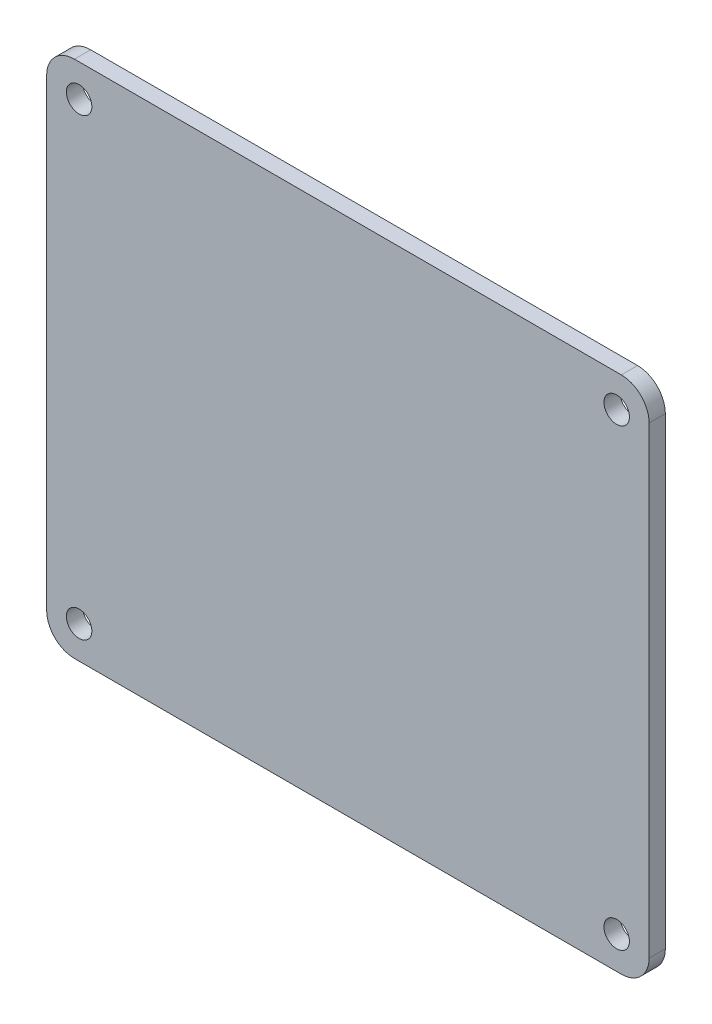
ISO-10303-21;
HEADER;
FILE_DESCRIPTION(('STEP AP214'),'2;1');
FILE_NAME('part.step','',(''),(''),'','','');
FILE_SCHEMA(('AUTOMOTIVE_DESIGN { 1 0 10303 214 1 1 1 1 }'));
ENDSEC;
DATA;
#1=APPLICATION_CONTEXT('core data for automotive mechanical design processes');
#2=APPLICATION_PROTOCOL_DEFINITION('international standard','automotive_design',2000,#1);
#3=PRODUCT_CONTEXT('',#1,'mechanical');
#4=PRODUCT('Part','Part','',(#3));
#5=PRODUCT_RELATED_PRODUCT_CATEGORY('part','',(#4));
#6=PRODUCT_DEFINITION_FORMATION('','',#4);
#7=PRODUCT_DEFINITION_CONTEXT('part definition',#1,'design');
#8=PRODUCT_DEFINITION('design','',#6,#7);
#9=PRODUCT_DEFINITION_SHAPE('','',#8);
#10=(LENGTH_UNIT() NAMED_UNIT(*) SI_UNIT(.MILLI.,.METRE.));
#11=(NAMED_UNIT(*) PLANE_ANGLE_UNIT() SI_UNIT($,.RADIAN.));
#12=(NAMED_UNIT(*) SI_UNIT($,.STERADIAN.) SOLID_ANGLE_UNIT());
#13=UNCERTAINTY_MEASURE_WITH_UNIT(LENGTH_MEASURE(1.E-05),#10,'distance_accuracy_value','');
#14=(GEOMETRIC_REPRESENTATION_CONTEXT(3) GLOBAL_UNCERTAINTY_ASSIGNED_CONTEXT((#13)) GLOBAL_UNIT_ASSIGNED_CONTEXT((#10,
#11,#12)) REPRESENTATION_CONTEXT('',''));
#15=CARTESIAN_POINT('',(0.,0.,0.));
#16=DIRECTION('',(0.,0.,1.));
#17=DIRECTION('',(1.,0.,0.));
#18=AXIS2_PLACEMENT_3D('',#15,#16,#17);
#19=CARTESIAN_POINT('',(29.,-24.5,0.));
#20=DIRECTION('',(0.,0.,-1.));
#21=DIRECTION('',(-1.,0.,0.));
#22=AXIS2_PLACEMENT_3D('',#19,#20,#21);
#23=CYLINDRICAL_SURFACE('',#22,1.375);
#24=CARTESIAN_POINT('',(29.,-24.5,1.75));
#25=DIRECTION('',(0.,0.,-1.));
#26=DIRECTION('',(-1.,0.,0.));
#27=AXIS2_PLACEMENT_3D('',#24,#25,#26);
#28=CIRCLE('',#27,1.375);
#29=CARTESIAN_POINT('',(30.375,-24.5,1.75));
#30=VERTEX_POINT('',#29);
#31=EDGE_CURVE('E35',#30,#30,#28,.T.);
#32=ORIENTED_EDGE('',*,*,#31,.F.);
#33=EDGE_LOOP('',(#32));
#34=FACE_BOUND('',#33,.T.);
#35=CARTESIAN_POINT('',(29.,-24.5,0.));
#36=DIRECTION('',(0.,0.,1.));
#37=DIRECTION('',(-1.,0.,0.));
#38=AXIS2_PLACEMENT_3D('',#35,#36,#37);
#39=CIRCLE('',#38,1.375);
#40=CARTESIAN_POINT('',(30.375,-24.5,0.));
#41=VERTEX_POINT('',#40);
#42=EDGE_CURVE('E109',#41,#41,#39,.T.);
#43=ORIENTED_EDGE('',*,*,#42,.F.);
#44=EDGE_LOOP('',(#43));
#45=FACE_BOUND('',#44,.T.);
#46=ADVANCED_FACE('F17',(#34,#45),#23,.F.);
#47=CARTESIAN_POINT('',(-29.,-24.5,0.));
#48=DIRECTION('',(0.,0.,-1.));
#49=DIRECTION('',(-1.,0.,0.));
#50=AXIS2_PLACEMENT_3D('',#47,#48,#49);
#51=CYLINDRICAL_SURFACE('',#50,1.375);
#52=CARTESIAN_POINT('',(-29.,-24.5,1.75));
#53=DIRECTION('',(0.,0.,-1.));
#54=DIRECTION('',(-1.,0.,0.));
#55=AXIS2_PLACEMENT_3D('',#52,#53,#54);
#56=CIRCLE('',#55,1.375);
#57=CARTESIAN_POINT('',(-27.625,-24.5,1.75));
#58=VERTEX_POINT('',#57);
#59=EDGE_CURVE('E145',#58,#58,#56,.T.);
#60=ORIENTED_EDGE('',*,*,#59,.F.);
#61=EDGE_LOOP('',(#60));
#62=FACE_BOUND('',#61,.T.);
#63=CARTESIAN_POINT('',(-29.,-24.5,0.));
#64=DIRECTION('',(0.,0.,1.));
#65=DIRECTION('',(-1.,0.,0.));
#66=AXIS2_PLACEMENT_3D('',#63,#64,#65);
#67=CIRCLE('',#66,1.375);
#68=CARTESIAN_POINT('',(-27.625,-24.5,0.));
#69=VERTEX_POINT('',#68);
#70=EDGE_CURVE('E106',#69,#69,#67,.T.);
#71=ORIENTED_EDGE('',*,*,#70,.F.);
#72=EDGE_LOOP('',(#71));
#73=FACE_BOUND('',#72,.T.);
#74=ADVANCED_FACE('F107',(#62,#73),#51,.F.);
#75=CARTESIAN_POINT('',(29.,24.5,0.));
#76=DIRECTION('',(0.,0.,-1.));
#77=DIRECTION('',(-1.,0.,0.));
#78=AXIS2_PLACEMENT_3D('',#75,#76,#77);
#79=CYLINDRICAL_SURFACE('',#78,1.375);
#80=CARTESIAN_POINT('',(29.,24.5,1.75));
#81=DIRECTION('',(0.,0.,-1.));
#82=DIRECTION('',(-1.,0.,0.));
#83=AXIS2_PLACEMENT_3D('',#80,#81,#82);
#84=CIRCLE('',#83,1.375);
#85=CARTESIAN_POINT('',(30.375,24.5,1.75));
#86=VERTEX_POINT('',#85);
#87=EDGE_CURVE('E141',#86,#86,#84,.T.);
#88=ORIENTED_EDGE('',*,*,#87,.F.);
#89=EDGE_LOOP('',(#88));
#90=FACE_BOUND('',#89,.T.);
#91=CARTESIAN_POINT('',(29.,24.5,0.));
#92=DIRECTION('',(0.,0.,1.));
#93=DIRECTION('',(-1.,0.,0.));
#94=AXIS2_PLACEMENT_3D('',#91,#92,#93);
#95=CIRCLE('',#94,1.375);
#96=CARTESIAN_POINT('',(30.375,24.5,0.));
#97=VERTEX_POINT('',#96);
#98=EDGE_CURVE('E110',#97,#97,#95,.T.);
#99=ORIENTED_EDGE('',*,*,#98,.F.);
#100=EDGE_LOOP('',(#99));
#101=FACE_BOUND('',#100,.T.);
#102=ADVANCED_FACE('F258',(#90,#101),#79,.F.);
#103=CARTESIAN_POINT('',(-29.,24.5,0.));
#104=DIRECTION('',(0.,0.,-1.));
#105=DIRECTION('',(-1.,0.,0.));
#106=AXIS2_PLACEMENT_3D('',#103,#104,#105);
#107=CYLINDRICAL_SURFACE('',#106,1.375);
#108=CARTESIAN_POINT('',(-29.,24.5,1.75));
#109=DIRECTION('',(0.,0.,-1.));
#110=DIRECTION('',(-1.,0.,0.));
#111=AXIS2_PLACEMENT_3D('',#108,#109,#110);
#112=CIRCLE('',#111,1.375);
#113=CARTESIAN_POINT('',(-27.625,24.5,1.75));
#114=VERTEX_POINT('',#113);
#115=EDGE_CURVE('E139',#114,#114,#112,.T.);
#116=ORIENTED_EDGE('',*,*,#115,.F.);
#117=EDGE_LOOP('',(#116));
#118=FACE_BOUND('',#117,.T.);
#119=CARTESIAN_POINT('',(-29.,24.5,0.));
#120=DIRECTION('',(0.,0.,1.));
#121=DIRECTION('',(-1.,0.,0.));
#122=AXIS2_PLACEMENT_3D('',#119,#120,#121);
#123=CIRCLE('',#122,1.375);
#124=CARTESIAN_POINT('',(-27.625,24.5,0.));
#125=VERTEX_POINT('',#124);
#126=EDGE_CURVE('E116',#125,#125,#123,.T.);
#127=ORIENTED_EDGE('',*,*,#126,.F.);
#128=EDGE_LOOP('',(#127));
#129=FACE_BOUND('',#128,.T.);
#130=ADVANCED_FACE('F249',(#118,#129),#107,.F.);
#131=CARTESIAN_POINT('',(-29.5,25.,0.));
#132=DIRECTION('',(0.,0.,-1.));
#133=DIRECTION('',(0.,1.,0.));
#134=AXIS2_PLACEMENT_3D('',#131,#132,#133);
#135=CYLINDRICAL_SURFACE('',#134,3.);
#136=CARTESIAN_POINT('',(-29.5,25.,0.));
#137=DIRECTION('',(0.,0.,1.));
#138=DIRECTION('',(0.,1.,0.));
#139=AXIS2_PLACEMENT_3D('',#136,#137,#138);
#140=CIRCLE('',#139,3.);
#141=CARTESIAN_POINT('',(-29.5,28.,0.));
#142=VERTEX_POINT('',#141);
#143=CARTESIAN_POINT('',(-32.5,25.,0.));
#144=VERTEX_POINT('',#143);
#145=EDGE_CURVE('E11',#142,#144,#140,.T.);
#146=ORIENTED_EDGE('',*,*,#145,.T.);
#147=DIRECTION('',(0.,0.,1.));
#148=VECTOR('',#147,1.);
#149=CARTESIAN_POINT('',(-32.5,25.,0.));
#150=LINE('',#149,#148);
#151=CARTESIAN_POINT('',(-32.5,25.,1.75));
#152=VERTEX_POINT('',#151);
#153=EDGE_CURVE('E28',#144,#152,#150,.T.);
#154=ORIENTED_EDGE('',*,*,#153,.T.);
#155=CARTESIAN_POINT('',(-29.5,25.,1.75));
#156=DIRECTION('',(0.,0.,1.));
#157=DIRECTION('',(0.,1.,0.));
#158=AXIS2_PLACEMENT_3D('',#155,#156,#157);
#159=CIRCLE('',#158,3.);
#160=CARTESIAN_POINT('',(-29.5,28.,1.75));
#161=VERTEX_POINT('',#160);
#162=EDGE_CURVE('E113',#161,#152,#159,.T.);
#163=ORIENTED_EDGE('',*,*,#162,.F.);
#164=DIRECTION('',(0.,0.,1.));
#165=VECTOR('',#164,1.);
#166=CARTESIAN_POINT('',(-29.5,28.,0.));
#167=LINE('',#166,#165);
#168=EDGE_CURVE('E137',#142,#161,#167,.T.);
#169=ORIENTED_EDGE('',*,*,#168,.F.);
#170=EDGE_LOOP('',(#146,#154,#163,#169));
#171=FACE_BOUND('',#170,.T.);
#172=ADVANCED_FACE('F247',(#171),#135,.T.);
#173=CARTESIAN_POINT('',(29.5,28.,0.));
#174=DIRECTION('',(0.,1.,0.));
#175=DIRECTION('',(-1.,0.,0.));
#176=AXIS2_PLACEMENT_3D('',#173,#174,#175);
#177=PLANE('',#176);
#178=DIRECTION('',(-1.,0.,0.));
#179=VECTOR('',#178,1.);
#180=CARTESIAN_POINT('',(29.5,28.,0.));
#181=LINE('',#180,#179);
#182=CARTESIAN_POINT('',(29.5,28.,0.));
#183=VERTEX_POINT('',#182);
#184=EDGE_CURVE('E161',#183,#142,#181,.T.);
#185=ORIENTED_EDGE('',*,*,#184,.T.);
#186=ORIENTED_EDGE('',*,*,#168,.T.);
#187=DIRECTION('',(-1.,0.,0.));
#188=VECTOR('',#187,1.);
#189=CARTESIAN_POINT('',(29.5,28.,1.75));
#190=LINE('',#189,#188);
#191=CARTESIAN_POINT('',(29.5,28.,1.75));
#192=VERTEX_POINT('',#191);
#193=EDGE_CURVE('E187',#192,#161,#190,.T.);
#194=ORIENTED_EDGE('',*,*,#193,.F.);
#195=DIRECTION('',(0.,0.,1.));
#196=VECTOR('',#195,1.);
#197=CARTESIAN_POINT('',(29.5,28.,0.));
#198=LINE('',#197,#196);
#199=EDGE_CURVE('E138',#183,#192,#198,.T.);
#200=ORIENTED_EDGE('',*,*,#199,.F.);
#201=EDGE_LOOP('',(#185,#186,#194,#200));
#202=FACE_BOUND('',#201,.T.);
#203=ADVANCED_FACE('F245',(#202),#177,.T.);
#204=CARTESIAN_POINT('',(29.5,25.,0.));
#205=DIRECTION('',(0.,0.,-1.));
#206=DIRECTION('',(1.,0.,0.));
#207=AXIS2_PLACEMENT_3D('',#204,#205,#206);
#208=CYLINDRICAL_SURFACE('',#207,3.);
#209=CARTESIAN_POINT('',(29.5,25.,0.));
#210=DIRECTION('',(0.,0.,1.));
#211=DIRECTION('',(1.,0.,0.));
#212=AXIS2_PLACEMENT_3D('',#209,#210,#211);
#213=CIRCLE('',#212,3.);
#214=CARTESIAN_POINT('',(32.5,25.,0.));
#215=VERTEX_POINT('',#214);
#216=EDGE_CURVE('E134',#215,#183,#213,.T.);
#217=ORIENTED_EDGE('',*,*,#216,.T.);
#218=ORIENTED_EDGE('',*,*,#199,.T.);
#219=CARTESIAN_POINT('',(29.5,25.,1.75));
#220=DIRECTION('',(0.,0.,1.));
#221=DIRECTION('',(1.,0.,0.));
#222=AXIS2_PLACEMENT_3D('',#219,#220,#221);
#223=CIRCLE('',#222,3.);
#224=CARTESIAN_POINT('',(32.5,25.,1.75));
#225=VERTEX_POINT('',#224);
#226=EDGE_CURVE('E21',#225,#192,#223,.T.);
#227=ORIENTED_EDGE('',*,*,#226,.F.);
#228=DIRECTION('',(0.,0.,1.));
#229=VECTOR('',#228,1.);
#230=CARTESIAN_POINT('',(32.5,25.,0.));
#231=LINE('',#230,#229);
#232=EDGE_CURVE('E194',#215,#225,#231,.T.);
#233=ORIENTED_EDGE('',*,*,#232,.F.);
#234=EDGE_LOOP('',(#217,#218,#227,#233));
#235=FACE_BOUND('',#234,.T.);
#236=ADVANCED_FACE('F237',(#235),#208,.T.);
#237=CARTESIAN_POINT('',(32.5,-25.,0.));
#238=DIRECTION('',(1.,0.,0.));
#239=DIRECTION('',(0.,1.,0.));
#240=AXIS2_PLACEMENT_3D('',#237,#238,#239);
#241=PLANE('',#240);
#242=DIRECTION('',(0.,1.,0.));
#243=VECTOR('',#242,1.);
#244=CARTESIAN_POINT('',(32.5,-25.,0.));
#245=LINE('',#244,#243);
#246=CARTESIAN_POINT('',(32.5,-25.,0.));
#247=VERTEX_POINT('',#246);
#248=EDGE_CURVE('E184',#247,#215,#245,.T.);
#249=ORIENTED_EDGE('',*,*,#248,.T.);
#250=ORIENTED_EDGE('',*,*,#232,.T.);
#251=DIRECTION('',(0.,1.,0.));
#252=VECTOR('',#251,1.);
#253=CARTESIAN_POINT('',(32.5,-25.,1.75));
#254=LINE('',#253,#252);
#255=CARTESIAN_POINT('',(32.5,-25.,1.75));
#256=VERTEX_POINT('',#255);
#257=EDGE_CURVE('E84',#256,#225,#254,.T.);
#258=ORIENTED_EDGE('',*,*,#257,.F.);
#259=DIRECTION('',(0.,0.,1.));
#260=VECTOR('',#259,1.);
#261=CARTESIAN_POINT('',(32.5,-25.,0.));
#262=LINE('',#261,#260);
#263=EDGE_CURVE('E90',#247,#256,#262,.T.);
#264=ORIENTED_EDGE('',*,*,#263,.F.);
#265=EDGE_LOOP('',(#249,#250,#258,#264));
#266=FACE_BOUND('',#265,.T.);
#267=ADVANCED_FACE('F240',(#266),#241,.T.);
#268=CARTESIAN_POINT('',(29.5,-25.,0.));
#269=DIRECTION('',(0.,0.,-1.));
#270=DIRECTION('',(0.,-1.,0.));
#271=AXIS2_PLACEMENT_3D('',#268,#269,#270);
#272=CYLINDRICAL_SURFACE('',#271,3.);
#273=CARTESIAN_POINT('',(29.5,-25.,0.));
#274=DIRECTION('',(0.,0.,1.));
#275=DIRECTION('',(0.,-1.,0.));
#276=AXIS2_PLACEMENT_3D('',#273,#274,#275);
#277=CIRCLE('',#276,3.);
#278=CARTESIAN_POINT('',(29.5,-28.,0.));
#279=VERTEX_POINT('',#278);
#280=EDGE_CURVE('E180',#279,#247,#277,.T.);
#281=ORIENTED_EDGE('',*,*,#280,.T.);
#282=ORIENTED_EDGE('',*,*,#263,.T.);
#283=CARTESIAN_POINT('',(29.5,-25.,1.75));
#284=DIRECTION('',(0.,0.,1.));
#285=DIRECTION('',(0.,-1.,0.));
#286=AXIS2_PLACEMENT_3D('',#283,#284,#285);
#287=CIRCLE('',#286,3.);
#288=CARTESIAN_POINT('',(29.5,-28.,1.75));
#289=VERTEX_POINT('',#288);
#290=EDGE_CURVE('E124',#289,#256,#287,.T.);
#291=ORIENTED_EDGE('',*,*,#290,.F.);
#292=DIRECTION('',(0.,0.,1.));
#293=VECTOR('',#292,1.);
#294=CARTESIAN_POINT('',(29.5,-28.,0.));
#295=LINE('',#294,#293);
#296=EDGE_CURVE('E125',#279,#289,#295,.T.);
#297=ORIENTED_EDGE('',*,*,#296,.F.);
#298=EDGE_LOOP('',(#281,#282,#291,#297));
#299=FACE_BOUND('',#298,.T.);
#300=ADVANCED_FACE('F19',(#299),#272,.T.);
#301=CARTESIAN_POINT('',(-29.5,-28.,0.));
#302=DIRECTION('',(0.,-1.,0.));
#303=DIRECTION('',(1.,0.,0.));
#304=AXIS2_PLACEMENT_3D('',#301,#302,#303);
#305=PLANE('',#304);
#306=DIRECTION('',(1.,0.,0.));
#307=VECTOR('',#306,1.);
#308=CARTESIAN_POINT('',(-29.5,-28.,0.));
#309=LINE('',#308,#307);
#310=CARTESIAN_POINT('',(-29.5,-28.,0.));
#311=VERTEX_POINT('',#310);
#312=EDGE_CURVE('E129',#311,#279,#309,.T.);
#313=ORIENTED_EDGE('',*,*,#312,.T.);
#314=ORIENTED_EDGE('',*,*,#296,.T.);
#315=DIRECTION('',(1.,0.,0.));
#316=VECTOR('',#315,1.);
#317=CARTESIAN_POINT('',(-29.5,-28.,1.75));
#318=LINE('',#317,#316);
#319=CARTESIAN_POINT('',(-29.5,-28.,1.75));
#320=VERTEX_POINT('',#319);
#321=EDGE_CURVE('E158',#320,#289,#318,.T.);
#322=ORIENTED_EDGE('',*,*,#321,.F.);
#323=DIRECTION('',(0.,0.,1.));
#324=VECTOR('',#323,1.);
#325=CARTESIAN_POINT('',(-29.5,-28.,0.));
#326=LINE('',#325,#324);
#327=EDGE_CURVE('E172',#311,#320,#326,.T.);
#328=ORIENTED_EDGE('',*,*,#327,.F.);
#329=EDGE_LOOP('',(#313,#314,#322,#328));
#330=FACE_BOUND('',#329,.T.);
#331=ADVANCED_FACE('F219',(#330),#305,.T.);
#332=CARTESIAN_POINT('',(-29.5,-25.,0.));
#333=DIRECTION('',(0.,0.,-1.));
#334=DIRECTION('',(-1.,0.,0.));
#335=AXIS2_PLACEMENT_3D('',#332,#333,#334);
#336=CYLINDRICAL_SURFACE('',#335,3.);
#337=CARTESIAN_POINT('',(-29.5,-25.,0.));
#338=DIRECTION('',(0.,0.,1.));
#339=DIRECTION('',(-1.,0.,0.));
#340=AXIS2_PLACEMENT_3D('',#337,#338,#339);
#341=CIRCLE('',#340,3.);
#342=CARTESIAN_POINT('',(-32.5,-25.,0.));
#343=VERTEX_POINT('',#342);
#344=EDGE_CURVE('E130',#343,#311,#341,.T.);
#345=ORIENTED_EDGE('',*,*,#344,.T.);
#346=ORIENTED_EDGE('',*,*,#327,.T.);
#347=CARTESIAN_POINT('',(-29.5,-25.,1.75));
#348=DIRECTION('',(0.,0.,1.));
#349=DIRECTION('',(-1.,0.,0.));
#350=AXIS2_PLACEMENT_3D('',#347,#348,#349);
#351=CIRCLE('',#350,3.);
#352=CARTESIAN_POINT('',(-32.5,-25.,1.75));
#353=VERTEX_POINT('',#352);
#354=EDGE_CURVE('E119',#353,#320,#351,.T.);
#355=ORIENTED_EDGE('',*,*,#354,.F.);
#356=DIRECTION('',(0.,0.,1.));
#357=VECTOR('',#356,1.);
#358=CARTESIAN_POINT('',(-32.5,-25.,0.));
#359=LINE('',#358,#357);
#360=EDGE_CURVE('E173',#343,#353,#359,.T.);
#361=ORIENTED_EDGE('',*,*,#360,.F.);
#362=EDGE_LOOP('',(#345,#346,#355,#361));
#363=FACE_BOUND('',#362,.T.);
#364=ADVANCED_FACE('F226',(#363),#336,.T.);
#365=CARTESIAN_POINT('',(-32.5,25.,0.));
#366=DIRECTION('',(-1.,0.,0.));
#367=DIRECTION('',(0.,-1.,0.));
#368=AXIS2_PLACEMENT_3D('',#365,#366,#367);
#369=PLANE('',#368);
#370=DIRECTION('',(0.,-1.,0.));
#371=VECTOR('',#370,1.);
#372=CARTESIAN_POINT('',(-32.5,25.,0.));
#373=LINE('',#372,#371);
#374=EDGE_CURVE('E177',#144,#343,#373,.T.);
#375=ORIENTED_EDGE('',*,*,#374,.T.);
#376=ORIENTED_EDGE('',*,*,#360,.T.);
#377=DIRECTION('',(0.,-1.,0.));
#378=VECTOR('',#377,1.);
#379=CARTESIAN_POINT('',(-32.5,25.,1.75));
#380=LINE('',#379,#378);
#381=EDGE_CURVE('E142',#152,#353,#380,.T.);
#382=ORIENTED_EDGE('',*,*,#381,.F.);
#383=ORIENTED_EDGE('',*,*,#153,.F.);
#384=EDGE_LOOP('',(#375,#376,#382,#383));
#385=FACE_BOUND('',#384,.T.);
#386=ADVANCED_FACE('F229',(#385),#369,.T.);
#387=CARTESIAN_POINT('',(0.,0.,1.75));
#388=DIRECTION('',(0.,0.,1.));
#389=DIRECTION('',(1.,0.,0.));
#390=AXIS2_PLACEMENT_3D('',#387,#388,#389);
#391=PLANE('',#390);
#392=ORIENTED_EDGE('',*,*,#31,.T.);
#393=EDGE_LOOP('',(#392));
#394=FACE_BOUND('',#393,.T.);
#395=ORIENTED_EDGE('',*,*,#59,.T.);
#396=EDGE_LOOP('',(#395));
#397=FACE_BOUND('',#396,.T.);
#398=ORIENTED_EDGE('',*,*,#87,.T.);
#399=EDGE_LOOP('',(#398));
#400=FACE_BOUND('',#399,.T.);
#401=ORIENTED_EDGE('',*,*,#115,.T.);
#402=EDGE_LOOP('',(#401));
#403=FACE_BOUND('',#402,.T.);
#404=ORIENTED_EDGE('',*,*,#381,.T.);
#405=ORIENTED_EDGE('',*,*,#354,.T.);
#406=ORIENTED_EDGE('',*,*,#321,.T.);
#407=ORIENTED_EDGE('',*,*,#290,.T.);
#408=ORIENTED_EDGE('',*,*,#257,.T.);
#409=ORIENTED_EDGE('',*,*,#226,.T.);
#410=ORIENTED_EDGE('',*,*,#193,.T.);
#411=ORIENTED_EDGE('',*,*,#162,.T.);
#412=EDGE_LOOP('',(#404,#405,#406,#407,#408,#409,#410,#411));
#413=FACE_BOUND('',#412,.T.);
#414=ADVANCED_FACE('F213',(#394,#397,#400,#403,#413),#391,.T.);
#415=CARTESIAN_POINT('',(0.,0.,0.));
#416=DIRECTION('',(0.,0.,1.));
#417=DIRECTION('',(1.,0.,0.));
#418=AXIS2_PLACEMENT_3D('',#415,#416,#417);
#419=PLANE('',#418);
#420=ORIENTED_EDGE('',*,*,#42,.T.);
#421=EDGE_LOOP('',(#420));
#422=FACE_BOUND('',#421,.T.);
#423=ORIENTED_EDGE('',*,*,#70,.T.);
#424=EDGE_LOOP('',(#423));
#425=FACE_BOUND('',#424,.T.);
#426=ORIENTED_EDGE('',*,*,#98,.T.);
#427=EDGE_LOOP('',(#426));
#428=FACE_BOUND('',#427,.T.);
#429=ORIENTED_EDGE('',*,*,#126,.T.);
#430=EDGE_LOOP('',(#429));
#431=FACE_BOUND('',#430,.T.);
#432=ORIENTED_EDGE('',*,*,#374,.F.);
#433=ORIENTED_EDGE('',*,*,#145,.F.);
#434=ORIENTED_EDGE('',*,*,#184,.F.);
#435=ORIENTED_EDGE('',*,*,#216,.F.);
#436=ORIENTED_EDGE('',*,*,#248,.F.);
#437=ORIENTED_EDGE('',*,*,#280,.F.);
#438=ORIENTED_EDGE('',*,*,#312,.F.);
#439=ORIENTED_EDGE('',*,*,#344,.F.);
#440=EDGE_LOOP('',(#432,#433,#434,#435,#436,#437,#438,#439));
#441=FACE_BOUND('',#440,.T.);
#442=ADVANCED_FACE('F224',(#422,#425,#428,#431,#441),#419,.F.);
#443=CLOSED_SHELL('',(#46,#74,#102,#130,#172,#203,#236,#267,#300,#331,#364,#386,#414,#442));
#444=MANIFOLD_SOLID_BREP('B1',#443);
#445=ADVANCED_BREP_SHAPE_REPRESENTATION('',(#18,#444),#14);
#446=SHAPE_DEFINITION_REPRESENTATION(#9,#445);
ENDSEC;
END-ISO-10303-21;
